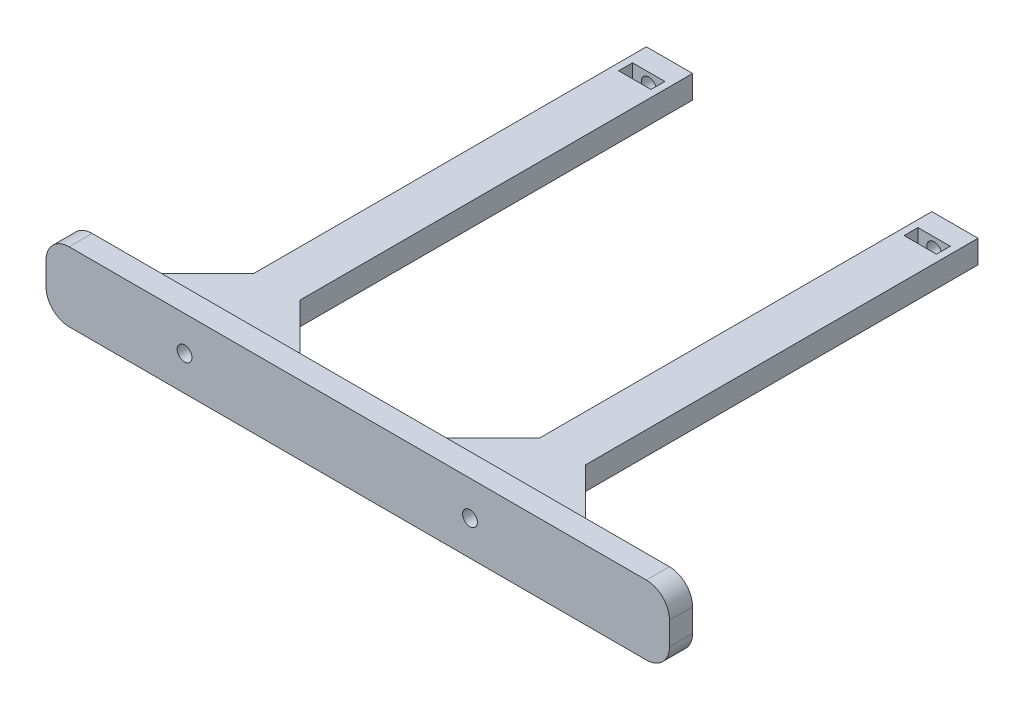
ISO-10303-21;
HEADER;
FILE_DESCRIPTION(('STEP AP214'),'2;1');
FILE_NAME('part.step','',(''),(''),'','','');
FILE_SCHEMA(('AUTOMOTIVE_DESIGN { 1 0 10303 214 1 1 1 1 }'));
ENDSEC;
DATA;
#1=APPLICATION_CONTEXT('core data for automotive mechanical design processes');
#2=APPLICATION_PROTOCOL_DEFINITION('international standard','automotive_design',2000,#1);
#3=PRODUCT_CONTEXT('',#1,'mechanical');
#4=PRODUCT('Part','Part','',(#3));
#5=PRODUCT_RELATED_PRODUCT_CATEGORY('part','',(#4));
#6=PRODUCT_DEFINITION_FORMATION('','',#4);
#7=PRODUCT_DEFINITION_CONTEXT('part definition',#1,'design');
#8=PRODUCT_DEFINITION('design','',#6,#7);
#9=PRODUCT_DEFINITION_SHAPE('','',#8);
#10=(LENGTH_UNIT() NAMED_UNIT(*) SI_UNIT(.MILLI.,.METRE.));
#11=(NAMED_UNIT(*) PLANE_ANGLE_UNIT() SI_UNIT($,.RADIAN.));
#12=(NAMED_UNIT(*) SI_UNIT($,.STERADIAN.) SOLID_ANGLE_UNIT());
#13=UNCERTAINTY_MEASURE_WITH_UNIT(LENGTH_MEASURE(1.E-05),#10,'distance_accuracy_value','');
#14=(GEOMETRIC_REPRESENTATION_CONTEXT(3) GLOBAL_UNCERTAINTY_ASSIGNED_CONTEXT((#13)) GLOBAL_UNIT_ASSIGNED_CONTEXT((#10,
#11,#12)) REPRESENTATION_CONTEXT('',''));
#15=CARTESIAN_POINT('',(0.,0.,0.));
#16=DIRECTION('',(0.,0.,1.));
#17=DIRECTION('',(1.,0.,0.));
#18=AXIS2_PLACEMENT_3D('',#15,#16,#17);
#19=CARTESIAN_POINT('',(-22.7658705386994,-0.757071557066315,-100.));
#20=DIRECTION('',(-1.,0.,0.));
#21=DIRECTION('',(0.,0.,1.));
#22=AXIS2_PLACEMENT_3D('',#19,#20,#21);
#23=PLANE('',#22);
#24=DIRECTION('',(0.,-1.,0.));
#25=VECTOR('',#24,1.);
#26=CARTESIAN_POINT('',(-22.7658705386994,4.24292844293368,-15.));
#27=LINE('',#26,#25);
#28=CARTESIAN_POINT('',(-22.7658705386994,4.24292844293368,-15.));
#29=VERTEX_POINT('',#28);
#30=CARTESIAN_POINT('',(-22.7658705386994,-0.757071557066316,-15.));
#31=VERTEX_POINT('',#30);
#32=EDGE_CURVE('E298',#29,#31,#27,.T.);
#33=ORIENTED_EDGE('',*,*,#32,.T.);
#34=DIRECTION('',(0.,0.,1.));
#35=VECTOR('',#34,1.);
#36=CARTESIAN_POINT('',(-22.7658705386994,-0.757071557066315,-100.));
#37=LINE('',#36,#35);
#38=CARTESIAN_POINT('',(-22.7658705386994,-0.757071557066315,-100.));
#39=VERTEX_POINT('',#38);
#40=EDGE_CURVE('E354',#39,#31,#37,.T.);
#41=ORIENTED_EDGE('',*,*,#40,.F.);
#42=DIRECTION('',(0.,-1.,0.));
#43=VECTOR('',#42,1.);
#44=CARTESIAN_POINT('',(-22.7658705386994,-0.757071557066315,-100.));
#45=LINE('',#44,#43);
#46=CARTESIAN_POINT('',(-22.7658705386994,4.24292844293368,-100.));
#47=VERTEX_POINT('',#46);
#48=EDGE_CURVE('E346',#47,#39,#45,.T.);
#49=ORIENTED_EDGE('',*,*,#48,.F.);
#50=DIRECTION('',(0.,0.,1.));
#51=VECTOR('',#50,1.);
#52=CARTESIAN_POINT('',(-22.7658705386994,4.24292844293368,-100.));
#53=LINE('',#52,#51);
#54=EDGE_CURVE('E357',#47,#29,#53,.T.);
#55=ORIENTED_EDGE('',*,*,#54,.T.);
#56=EDGE_LOOP('',(#33,#41,#49,#55));
#57=FACE_BOUND('',#56,.T.);
#58=ADVANCED_FACE('F36',(#57),#23,.F.);
#59=CARTESIAN_POINT('',(29.0341294613006,-0.757071557066316,-100.));
#60=DIRECTION('',(1.,0.,0.));
#61=DIRECTION('',(0.,0.,-1.));
#62=AXIS2_PLACEMENT_3D('',#59,#60,#61);
#63=PLANE('',#62);
#64=DIRECTION('',(0.,-1.,0.));
#65=VECTOR('',#64,1.);
#66=CARTESIAN_POINT('',(29.0341294613006,4.24292844293368,-15.));
#67=LINE('',#66,#65);
#68=CARTESIAN_POINT('',(29.0341294613006,4.24292844293368,-15.));
#69=VERTEX_POINT('',#68);
#70=CARTESIAN_POINT('',(29.0341294613006,-0.757071557066316,-15.));
#71=VERTEX_POINT('',#70);
#72=EDGE_CURVE('E313',#69,#71,#67,.T.);
#73=ORIENTED_EDGE('',*,*,#72,.F.);
#74=DIRECTION('',(0.,0.,1.));
#75=VECTOR('',#74,1.);
#76=CARTESIAN_POINT('',(29.0341294613006,4.24292844293368,-100.));
#77=LINE('',#76,#75);
#78=CARTESIAN_POINT('',(29.0341294613006,4.24292844293368,-100.));
#79=VERTEX_POINT('',#78);
#80=EDGE_CURVE('E384',#79,#69,#77,.T.);
#81=ORIENTED_EDGE('',*,*,#80,.F.);
#82=DIRECTION('',(0.,1.,0.));
#83=VECTOR('',#82,1.);
#84=CARTESIAN_POINT('',(29.0341294613006,-0.757071557066316,-100.));
#85=LINE('',#84,#83);
#86=CARTESIAN_POINT('',(29.0341294613006,-0.757071557066316,-100.));
#87=VERTEX_POINT('',#86);
#88=EDGE_CURVE('E364',#87,#79,#85,.T.);
#89=ORIENTED_EDGE('',*,*,#88,.F.);
#90=DIRECTION('',(0.,0.,1.));
#91=VECTOR('',#90,1.);
#92=CARTESIAN_POINT('',(29.0341294613006,-0.757071557066316,-100.));
#93=LINE('',#92,#91);
#94=EDGE_CURVE('E374',#87,#71,#93,.T.);
#95=ORIENTED_EDGE('',*,*,#94,.T.);
#96=EDGE_LOOP('',(#73,#81,#89,#95));
#97=FACE_BOUND('',#96,.T.);
#98=ADVANCED_FACE('F496',(#97),#63,.F.);
#99=CARTESIAN_POINT('',(-32.7658705386994,-0.757071557066315,-100.));
#100=DIRECTION('',(1.,0.,0.));
#101=DIRECTION('',(0.,0.,-1.));
#102=AXIS2_PLACEMENT_3D('',#99,#100,#101);
#103=PLANE('',#102);
#104=DIRECTION('',(0.,-1.,0.));
#105=VECTOR('',#104,1.);
#106=CARTESIAN_POINT('',(-32.7658705386994,4.24292844293368,-15.));
#107=LINE('',#106,#105);
#108=CARTESIAN_POINT('',(-32.7658705386994,4.24292844293368,-15.));
#109=VERTEX_POINT('',#108);
#110=CARTESIAN_POINT('',(-32.7658705386994,-0.757071557066315,-15.));
#111=VERTEX_POINT('',#110);
#112=EDGE_CURVE('E336',#109,#111,#107,.T.);
#113=ORIENTED_EDGE('',*,*,#112,.F.);
#114=DIRECTION('',(0.,0.,1.));
#115=VECTOR('',#114,1.);
#116=CARTESIAN_POINT('',(-32.7658705386994,4.24292844293368,-100.));
#117=LINE('',#116,#115);
#118=CARTESIAN_POINT('',(-32.7658705386994,4.24292844293368,-100.));
#119=VERTEX_POINT('',#118);
#120=EDGE_CURVE('E360',#119,#109,#117,.T.);
#121=ORIENTED_EDGE('',*,*,#120,.F.);
#122=DIRECTION('',(0.,1.,0.));
#123=VECTOR('',#122,1.);
#124=CARTESIAN_POINT('',(-32.7658705386994,-0.757071557066315,-100.));
#125=LINE('',#124,#123);
#126=CARTESIAN_POINT('',(-32.7658705386994,-0.757071557066315,-100.));
#127=VERTEX_POINT('',#126);
#128=EDGE_CURVE('E340',#127,#119,#125,.T.);
#129=ORIENTED_EDGE('',*,*,#128,.F.);
#130=DIRECTION('',(0.,0.,1.));
#131=VECTOR('',#130,1.);
#132=CARTESIAN_POINT('',(-32.7658705386994,-0.757071557066315,-100.));
#133=LINE('',#132,#131);
#134=EDGE_CURVE('E350',#127,#111,#133,.T.);
#135=ORIENTED_EDGE('',*,*,#134,.T.);
#136=EDGE_LOOP('',(#113,#121,#129,#135));
#137=FACE_BOUND('',#136,.T.);
#138=ADVANCED_FACE('F502',(#137),#103,.F.);
#139=CARTESIAN_POINT('',(0.,0.,0.));
#140=DIRECTION('',(0.,0.,1.));
#141=DIRECTION('',(1.,0.,0.));
#142=AXIS2_PLACEMENT_3D('',#139,#140,#141);
#143=PLANE('',#142);
#144=DIRECTION('',(1.,0.,0.));
#145=VECTOR('',#144,1.);
#146=CARTESIAN_POINT('',(39.0341294613006,4.24292844293368,0.));
#147=LINE('',#146,#145);
#148=CARTESIAN_POINT('',(14.0341294613007,4.24292844293368,0.));
#149=VERTEX_POINT('',#148);
#150=CARTESIAN_POINT('',(54.0341294613006,4.24292844293368,0.));
#151=VERTEX_POINT('',#150);
#152=EDGE_CURVE('E363',#149,#151,#147,.T.);
#153=ORIENTED_EDGE('',*,*,#152,.F.);
#154=DIRECTION('',(0.,-1.,0.));
#155=VECTOR('',#154,1.);
#156=CARTESIAN_POINT('',(14.0341294613006,4.24292844293368,0.));
#157=LINE('',#156,#155);
#158=CARTESIAN_POINT('',(14.0341294613006,-0.757071557066316,0.));
#159=VERTEX_POINT('',#158);
#160=EDGE_CURVE('E310',#149,#159,#157,.T.);
#161=ORIENTED_EDGE('',*,*,#160,.T.);
#162=DIRECTION('',(-1.,0.,0.));
#163=VECTOR('',#162,1.);
#164=CARTESIAN_POINT('',(39.0341294613006,-0.757071557066316,0.));
#165=LINE('',#164,#163);
#166=CARTESIAN_POINT('',(54.0341294613006,-0.757071557066315,0.));
#167=VERTEX_POINT('',#166);
#168=EDGE_CURVE('E368',#167,#159,#165,.T.);
#169=ORIENTED_EDGE('',*,*,#168,.F.);
#170=DIRECTION('',(0.,1.,0.));
#171=VECTOR('',#170,1.);
#172=CARTESIAN_POINT('',(54.0341294613006,-21.9702749926627,0.));
#173=LINE('',#172,#171);
#174=EDGE_CURVE('E319',#167,#151,#173,.T.);
#175=ORIENTED_EDGE('',*,*,#174,.T.);
#176=EDGE_LOOP('',(#153,#161,#169,#175));
#177=FACE_BOUND('',#176,.T.);
#178=DIRECTION('',(-1.,0.,0.));
#179=VECTOR('',#178,1.);
#180=CARTESIAN_POINT('',(-57.7658705386994,9.24292844293369,0.));
#181=LINE('',#180,#179);
#182=CARTESIAN_POINT('',(72.2341294613006,9.24292844293369,0.));
#183=VERTEX_POINT('',#182);
#184=CARTESIAN_POINT('',(-52.7658705386994,9.24292844293369,0.));
#185=VERTEX_POINT('',#184);
#186=EDGE_CURVE('E398',#183,#185,#181,.T.);
#187=ORIENTED_EDGE('',*,*,#186,.F.);
#188=CARTESIAN_POINT('',(72.2341294613006,4.24292844293369,0.));
#189=DIRECTION('',(0.,0.,1.));
#190=DIRECTION('',(1.,0.,0.));
#191=AXIS2_PLACEMENT_3D('',#188,#189,#190);
#192=CIRCLE('',#191,5.);
#193=CARTESIAN_POINT('',(77.2341294613007,4.24292844293369,0.));
#194=VERTEX_POINT('',#193);
#195=EDGE_CURVE('E440',#183,#194,#192,.F.);
#196=ORIENTED_EDGE('',*,*,#195,.T.);
#197=DIRECTION('',(0.,1.,0.));
#198=VECTOR('',#197,1.);
#199=CARTESIAN_POINT('',(77.2341294613007,9.24292844293369,0.));
#200=LINE('',#199,#198);
#201=CARTESIAN_POINT('',(77.2341294613007,-0.757071557066311,0.));
#202=VERTEX_POINT('',#201);
#203=EDGE_CURVE('E412',#202,#194,#200,.T.);
#204=ORIENTED_EDGE('',*,*,#203,.F.);
#205=CARTESIAN_POINT('',(72.2341294613006,-0.757071557066311,0.));
#206=DIRECTION('',(0.,0.,1.));
#207=DIRECTION('',(1.,0.,0.));
#208=AXIS2_PLACEMENT_3D('',#205,#206,#207);
#209=CIRCLE('',#208,5.);
#210=CARTESIAN_POINT('',(72.2341294613006,-5.75707155706631,0.));
#211=VERTEX_POINT('',#210);
#212=EDGE_CURVE('E438',#202,#211,#209,.F.);
#213=ORIENTED_EDGE('',*,*,#212,.T.);
#214=DIRECTION('',(1.,0.,0.));
#215=VECTOR('',#214,1.);
#216=CARTESIAN_POINT('',(-57.7658705386994,-5.75707155706631,0.));
#217=LINE('',#216,#215);
#218=CARTESIAN_POINT('',(-52.7658705386994,-5.75707155706631,0.));
#219=VERTEX_POINT('',#218);
#220=EDGE_CURVE('E409',#219,#211,#217,.T.);
#221=ORIENTED_EDGE('',*,*,#220,.F.);
#222=CARTESIAN_POINT('',(-52.7658705386994,-0.757071557066312,0.));
#223=DIRECTION('',(0.,0.,1.));
#224=DIRECTION('',(1.,0.,0.));
#225=AXIS2_PLACEMENT_3D('',#222,#223,#224);
#226=CIRCLE('',#225,5.);
#227=CARTESIAN_POINT('',(-57.7658705386994,-0.757071557066311,0.));
#228=VERTEX_POINT('',#227);
#229=EDGE_CURVE('E421',#219,#228,#226,.F.);
#230=ORIENTED_EDGE('',*,*,#229,.T.);
#231=DIRECTION('',(0.,-1.,0.));
#232=VECTOR('',#231,1.);
#233=CARTESIAN_POINT('',(-57.7658705386994,9.24292844293369,0.));
#234=LINE('',#233,#232);
#235=CARTESIAN_POINT('',(-57.7658705386994,4.24292844293369,0.));
#236=VERTEX_POINT('',#235);
#237=EDGE_CURVE('E393',#236,#228,#234,.T.);
#238=ORIENTED_EDGE('',*,*,#237,.F.);
#239=CARTESIAN_POINT('',(-52.7658705386994,4.24292844293369,0.));
#240=DIRECTION('',(0.,0.,1.));
#241=DIRECTION('',(1.,0.,0.));
#242=AXIS2_PLACEMENT_3D('',#239,#240,#241);
#243=CIRCLE('',#242,5.);
#244=EDGE_CURVE('E418',#236,#185,#243,.F.);
#245=ORIENTED_EDGE('',*,*,#244,.T.);
#246=EDGE_LOOP('',(#187,#196,#204,#213,#221,#230,#238,#245));
#247=FACE_BOUND('',#246,.T.);
#248=DIRECTION('',(0.,-1.,0.));
#249=VECTOR('',#248,1.);
#250=CARTESIAN_POINT('',(-7.76587053869936,4.24292844293368,0.));
#251=LINE('',#250,#249);
#252=CARTESIAN_POINT('',(-7.76587053869936,4.24292844293368,0.));
#253=VERTEX_POINT('',#252);
#254=CARTESIAN_POINT('',(-7.76587053869936,-0.757071557066316,0.));
#255=VERTEX_POINT('',#254);
#256=EDGE_CURVE('E301',#253,#255,#251,.T.);
#257=ORIENTED_EDGE('',*,*,#256,.F.);
#258=DIRECTION('',(1.,0.,0.));
#259=VECTOR('',#258,1.);
#260=CARTESIAN_POINT('',(-22.7658705386994,4.24292844293368,0.));
#261=LINE('',#260,#259);
#262=CARTESIAN_POINT('',(-47.7658705386994,4.24292844293368,0.));
#263=VERTEX_POINT('',#262);
#264=EDGE_CURVE('E339',#263,#253,#261,.T.);
#265=ORIENTED_EDGE('',*,*,#264,.F.);
#266=DIRECTION('',(0.,-1.,0.));
#267=VECTOR('',#266,1.);
#268=CARTESIAN_POINT('',(-47.7658705386994,4.24292844293368,0.));
#269=LINE('',#268,#267);
#270=CARTESIAN_POINT('',(-47.7658705386994,-0.757071557066315,0.));
#271=VERTEX_POINT('',#270);
#272=EDGE_CURVE('E333',#263,#271,#269,.T.);
#273=ORIENTED_EDGE('',*,*,#272,.T.);
#274=DIRECTION('',(-1.,0.,0.));
#275=VECTOR('',#274,1.);
#276=CARTESIAN_POINT('',(-22.7658705386994,-0.757071557066315,0.));
#277=LINE('',#276,#275);
#278=EDGE_CURVE('E344',#255,#271,#277,.T.);
#279=ORIENTED_EDGE('',*,*,#278,.F.);
#280=EDGE_LOOP('',(#257,#265,#273,#279));
#281=FACE_BOUND('',#280,.T.);
#282=ADVANCED_FACE('F513',(#177,#247,#281),#143,.F.);
#283=CARTESIAN_POINT('',(-57.7658705386994,9.24292844293369,5.));
#284=DIRECTION('',(1.,0.,0.));
#285=DIRECTION('',(0.,0.,-1.));
#286=AXIS2_PLACEMENT_3D('',#283,#284,#285);
#287=PLANE('',#286);
#288=ORIENTED_EDGE('',*,*,#237,.T.);
#289=DIRECTION('',(0.,0.,-1.));
#290=VECTOR('',#289,1.);
#291=CARTESIAN_POINT('',(-57.7658705386994,-0.757071557066311,5.));
#292=LINE('',#291,#290);
#293=CARTESIAN_POINT('',(-57.7658705386994,-0.757071557066311,5.));
#294=VERTEX_POINT('',#293);
#295=EDGE_CURVE('E426',#228,#294,#292,.F.);
#296=ORIENTED_EDGE('',*,*,#295,.T.);
#297=DIRECTION('',(0.,-1.,0.));
#298=VECTOR('',#297,1.);
#299=CARTESIAN_POINT('',(-57.7658705386994,9.24292844293369,5.));
#300=LINE('',#299,#298);
#301=CARTESIAN_POINT('',(-57.7658705386994,4.24292844293369,5.));
#302=VERTEX_POINT('',#301);
#303=EDGE_CURVE('E394',#302,#294,#300,.T.);
#304=ORIENTED_EDGE('',*,*,#303,.F.);
#305=DIRECTION('',(0.,0.,-1.));
#306=VECTOR('',#305,1.);
#307=CARTESIAN_POINT('',(-57.7658705386994,4.24292844293369,5.));
#308=LINE('',#307,#306);
#309=EDGE_CURVE('E423',#302,#236,#308,.T.);
#310=ORIENTED_EDGE('',*,*,#309,.T.);
#311=EDGE_LOOP('',(#288,#296,#304,#310));
#312=FACE_BOUND('',#311,.T.);
#313=ADVANCED_FACE('F546',(#312),#287,.F.);
#314=CARTESIAN_POINT('',(-57.7658705386994,-5.75707155706631,5.));
#315=DIRECTION('',(0.,1.,0.));
#316=DIRECTION('',(0.,0.,1.));
#317=AXIS2_PLACEMENT_3D('',#314,#315,#316);
#318=PLANE('',#317);
#319=ORIENTED_EDGE('',*,*,#220,.T.);
#320=DIRECTION('',(0.,0.,-1.));
#321=VECTOR('',#320,1.);
#322=CARTESIAN_POINT('',(72.2341294613006,-5.75707155706631,5.));
#323=LINE('',#322,#321);
#324=CARTESIAN_POINT('',(72.2341294613006,-5.75707155706631,5.));
#325=VERTEX_POINT('',#324);
#326=EDGE_CURVE('E451',#211,#325,#323,.F.);
#327=ORIENTED_EDGE('',*,*,#326,.T.);
#328=DIRECTION('',(1.,0.,0.));
#329=VECTOR('',#328,1.);
#330=CARTESIAN_POINT('',(-57.7658705386994,-5.75707155706631,5.));
#331=LINE('',#330,#329);
#332=CARTESIAN_POINT('',(-52.7658705386994,-5.75707155706631,5.));
#333=VERTEX_POINT('',#332);
#334=EDGE_CURVE('E397',#333,#325,#331,.T.);
#335=ORIENTED_EDGE('',*,*,#334,.F.);
#336=DIRECTION('',(0.,0.,-1.));
#337=VECTOR('',#336,1.);
#338=CARTESIAN_POINT('',(-52.7658705386994,-5.75707155706631,5.));
#339=LINE('',#338,#337);
#340=EDGE_CURVE('E406',#333,#219,#339,.T.);
#341=ORIENTED_EDGE('',*,*,#340,.T.);
#342=EDGE_LOOP('',(#319,#327,#335,#341));
#343=FACE_BOUND('',#342,.T.);
#344=ADVANCED_FACE('F554',(#343),#318,.F.);
#345=CARTESIAN_POINT('',(77.2341294613007,9.24292844293369,5.));
#346=DIRECTION('',(-1.,0.,0.));
#347=DIRECTION('',(0.,0.,1.));
#348=AXIS2_PLACEMENT_3D('',#345,#346,#347);
#349=PLANE('',#348);
#350=ORIENTED_EDGE('',*,*,#203,.T.);
#351=DIRECTION('',(0.,0.,-1.));
#352=VECTOR('',#351,1.);
#353=CARTESIAN_POINT('',(77.2341294613007,4.24292844293369,5.));
#354=LINE('',#353,#352);
#355=CARTESIAN_POINT('',(77.2341294613007,4.24292844293369,5.));
#356=VERTEX_POINT('',#355);
#357=EDGE_CURVE('E445',#194,#356,#354,.F.);
#358=ORIENTED_EDGE('',*,*,#357,.T.);
#359=DIRECTION('',(0.,1.,0.));
#360=VECTOR('',#359,1.);
#361=CARTESIAN_POINT('',(77.2341294613007,9.24292844293369,5.));
#362=LINE('',#361,#360);
#363=CARTESIAN_POINT('',(77.2341294613007,-0.757071557066311,5.));
#364=VERTEX_POINT('',#363);
#365=EDGE_CURVE('E401',#364,#356,#362,.T.);
#366=ORIENTED_EDGE('',*,*,#365,.F.);
#367=DIRECTION('',(0.,0.,-1.));
#368=VECTOR('',#367,1.);
#369=CARTESIAN_POINT('',(77.2341294613007,-0.757071557066311,5.));
#370=LINE('',#369,#368);
#371=EDGE_CURVE('E442',#364,#202,#370,.T.);
#372=ORIENTED_EDGE('',*,*,#371,.T.);
#373=EDGE_LOOP('',(#350,#358,#366,#372));
#374=FACE_BOUND('',#373,.T.);
#375=ADVANCED_FACE('F550',(#374),#349,.F.);
#376=CARTESIAN_POINT('',(-57.7658705386994,9.24292844293369,5.));
#377=DIRECTION('',(0.,-1.,0.));
#378=DIRECTION('',(0.,0.,-1.));
#379=AXIS2_PLACEMENT_3D('',#376,#377,#378);
#380=PLANE('',#379);
#381=DIRECTION('',(-1.,0.,0.));
#382=VECTOR('',#381,1.);
#383=CARTESIAN_POINT('',(-57.7658705386994,9.24292844293369,5.));
#384=LINE('',#383,#382);
#385=CARTESIAN_POINT('',(72.2341294613006,9.24292844293369,5.));
#386=VERTEX_POINT('',#385);
#387=CARTESIAN_POINT('',(-52.7658705386994,9.24292844293369,5.));
#388=VERTEX_POINT('',#387);
#389=EDGE_CURVE('E404',#386,#388,#384,.T.);
#390=ORIENTED_EDGE('',*,*,#389,.F.);
#391=DIRECTION('',(0.,0.,-1.));
#392=VECTOR('',#391,1.);
#393=CARTESIAN_POINT('',(72.2341294613006,9.24292844293369,5.));
#394=LINE('',#393,#392);
#395=EDGE_CURVE('E435',#386,#183,#394,.T.);
#396=ORIENTED_EDGE('',*,*,#395,.T.);
#397=ORIENTED_EDGE('',*,*,#186,.T.);
#398=DIRECTION('',(0.,0.,-1.));
#399=VECTOR('',#398,1.);
#400=CARTESIAN_POINT('',(-52.7658705386994,9.24292844293369,5.));
#401=LINE('',#400,#399);
#402=EDGE_CURVE('E432',#185,#388,#401,.F.);
#403=ORIENTED_EDGE('',*,*,#402,.T.);
#404=EDGE_LOOP('',(#390,#396,#397,#403));
#405=FACE_BOUND('',#404,.T.);
#406=ADVANCED_FACE('F542',(#405),#380,.F.);
#407=CARTESIAN_POINT('',(0.,0.,5.));
#408=DIRECTION('',(0.,0.,1.));
#409=DIRECTION('',(1.,0.,0.));
#410=AXIS2_PLACEMENT_3D('',#407,#408,#409);
#411=PLANE('',#410);
#412=CARTESIAN_POINT('',(34.0341294613006,1.74292844293368,5.));
#413=DIRECTION('',(0.,0.,-1.));
#414=DIRECTION('',(-1.,0.,0.));
#415=AXIS2_PLACEMENT_3D('',#412,#413,#414);
#416=CIRCLE('',#415,1.6);
#417=CARTESIAN_POINT('',(32.4341294613006,1.74292844293368,5.));
#418=VERTEX_POINT('',#417);
#419=EDGE_CURVE('E387',#418,#418,#416,.T.);
#420=ORIENTED_EDGE('',*,*,#419,.T.);
#421=EDGE_LOOP('',(#420));
#422=FACE_BOUND('',#421,.T.);
#423=CARTESIAN_POINT('',(-27.7658705386994,1.74292844293368,5.));
#424=DIRECTION('',(0.,0.,-1.));
#425=DIRECTION('',(-1.,0.,0.));
#426=AXIS2_PLACEMENT_3D('',#423,#424,#425);
#427=CIRCLE('',#426,1.6);
#428=CARTESIAN_POINT('',(-29.3658705386994,1.74292844293368,5.));
#429=VERTEX_POINT('',#428);
#430=EDGE_CURVE('E390',#429,#429,#427,.T.);
#431=ORIENTED_EDGE('',*,*,#430,.T.);
#432=EDGE_LOOP('',(#431));
#433=FACE_BOUND('',#432,.T.);
#434=ORIENTED_EDGE('',*,*,#365,.T.);
#435=CARTESIAN_POINT('',(72.2341294613006,4.24292844293369,5.));
#436=DIRECTION('',(0.,0.,1.));
#437=DIRECTION('',(1.,0.,0.));
#438=AXIS2_PLACEMENT_3D('',#435,#436,#437);
#439=CIRCLE('',#438,5.);
#440=EDGE_CURVE('E449',#356,#386,#439,.T.);
#441=ORIENTED_EDGE('',*,*,#440,.T.);
#442=ORIENTED_EDGE('',*,*,#389,.T.);
#443=CARTESIAN_POINT('',(-52.7658705386994,4.24292844293369,5.));
#444=DIRECTION('',(0.,0.,1.));
#445=DIRECTION('',(1.,0.,0.));
#446=AXIS2_PLACEMENT_3D('',#443,#444,#445);
#447=CIRCLE('',#446,5.);
#448=EDGE_CURVE('E428',#388,#302,#447,.T.);
#449=ORIENTED_EDGE('',*,*,#448,.T.);
#450=ORIENTED_EDGE('',*,*,#303,.T.);
#451=CARTESIAN_POINT('',(-52.7658705386994,-0.757071557066312,5.));
#452=DIRECTION('',(0.,0.,1.));
#453=DIRECTION('',(1.,0.,0.));
#454=AXIS2_PLACEMENT_3D('',#451,#452,#453);
#455=CIRCLE('',#454,5.);
#456=EDGE_CURVE('E430',#294,#333,#455,.T.);
#457=ORIENTED_EDGE('',*,*,#456,.T.);
#458=ORIENTED_EDGE('',*,*,#334,.T.);
#459=CARTESIAN_POINT('',(72.2341294613006,-0.757071557066311,5.));
#460=DIRECTION('',(0.,0.,1.));
#461=DIRECTION('',(1.,0.,0.));
#462=AXIS2_PLACEMENT_3D('',#459,#460,#461);
#463=CIRCLE('',#462,5.);
#464=EDGE_CURVE('E447',#325,#364,#463,.T.);
#465=ORIENTED_EDGE('',*,*,#464,.T.);
#466=EDGE_LOOP('',(#434,#441,#442,#449,#450,#457,#458,#465));
#467=FACE_BOUND('',#466,.T.);
#468=ADVANCED_FACE('F538',(#422,#433,#467),#411,.T.);
#469=CARTESIAN_POINT('',(-52.7658705386994,-0.757071557066312,5.));
#470=DIRECTION('',(0.,0.,-1.));
#471=DIRECTION('',(-1.,0.,0.));
#472=AXIS2_PLACEMENT_3D('',#469,#470,#471);
#473=CYLINDRICAL_SURFACE('',#472,5.);
#474=ORIENTED_EDGE('',*,*,#456,.F.);
#475=ORIENTED_EDGE('',*,*,#295,.F.);
#476=ORIENTED_EDGE('',*,*,#229,.F.);
#477=ORIENTED_EDGE('',*,*,#340,.F.);
#478=EDGE_LOOP('',(#474,#475,#476,#477));
#479=FACE_BOUND('',#478,.T.);
#480=ADVANCED_FACE('F541',(#479),#473,.T.);
#481=CARTESIAN_POINT('',(-52.7658705386994,4.24292844293369,5.));
#482=DIRECTION('',(0.,0.,-1.));
#483=DIRECTION('',(-1.,0.,0.));
#484=AXIS2_PLACEMENT_3D('',#481,#482,#483);
#485=CYLINDRICAL_SURFACE('',#484,5.);
#486=ORIENTED_EDGE('',*,*,#448,.F.);
#487=ORIENTED_EDGE('',*,*,#402,.F.);
#488=ORIENTED_EDGE('',*,*,#244,.F.);
#489=ORIENTED_EDGE('',*,*,#309,.F.);
#490=EDGE_LOOP('',(#486,#487,#488,#489));
#491=FACE_BOUND('',#490,.T.);
#492=ADVANCED_FACE('F564',(#491),#485,.T.);
#493=CARTESIAN_POINT('',(72.2341294613006,4.24292844293369,5.));
#494=DIRECTION('',(0.,0.,-1.));
#495=DIRECTION('',(-1.,0.,0.));
#496=AXIS2_PLACEMENT_3D('',#493,#494,#495);
#497=CYLINDRICAL_SURFACE('',#496,5.);
#498=ORIENTED_EDGE('',*,*,#440,.F.);
#499=ORIENTED_EDGE('',*,*,#357,.F.);
#500=ORIENTED_EDGE('',*,*,#195,.F.);
#501=ORIENTED_EDGE('',*,*,#395,.F.);
#502=EDGE_LOOP('',(#498,#499,#500,#501));
#503=FACE_BOUND('',#502,.T.);
#504=ADVANCED_FACE('F567',(#503),#497,.T.);
#505=CARTESIAN_POINT('',(72.2341294613006,-0.757071557066311,5.));
#506=DIRECTION('',(0.,0.,-1.));
#507=DIRECTION('',(-1.,0.,0.));
#508=AXIS2_PLACEMENT_3D('',#505,#506,#507);
#509=CYLINDRICAL_SURFACE('',#508,5.);
#510=ORIENTED_EDGE('',*,*,#464,.F.);
#511=ORIENTED_EDGE('',*,*,#326,.F.);
#512=ORIENTED_EDGE('',*,*,#212,.F.);
#513=ORIENTED_EDGE('',*,*,#371,.F.);
#514=EDGE_LOOP('',(#510,#511,#512,#513));
#515=FACE_BOUND('',#514,.T.);
#516=ADVANCED_FACE('F38',(#515),#509,.T.);
#517=CARTESIAN_POINT('',(-27.7658705386994,1.74292844293368,5.));
#518=DIRECTION('',(0.,0.,-1.));
#519=DIRECTION('',(-1.,0.,0.));
#520=AXIS2_PLACEMENT_3D('',#517,#518,#519);
#521=CYLINDRICAL_SURFACE('',#520,1.6);
#522=ORIENTED_EDGE('',*,*,#430,.F.);
#523=EDGE_LOOP('',(#522));
#524=FACE_BOUND('',#523,.T.);
#525=CARTESIAN_POINT('',(-27.7658705386994,1.74292844293368,-92.5));
#526=DIRECTION('',(0.,0.,-1.));
#527=DIRECTION('',(-1.,0.,0.));
#528=AXIS2_PLACEMENT_3D('',#525,#526,#527);
#529=CIRCLE('',#528,1.6);
#530=CARTESIAN_POINT('',(-29.3658705386994,1.74292844293368,-92.5));
#531=VERTEX_POINT('',#530);
#532=EDGE_CURVE('E242',#531,#531,#529,.T.);
#533=ORIENTED_EDGE('',*,*,#532,.T.);
#534=EDGE_LOOP('',(#533));
#535=FACE_BOUND('',#534,.T.);
#536=ADVANCED_FACE('F531',(#524,#535),#521,.F.);
#537=CARTESIAN_POINT('',(34.0341294613006,1.74292844293368,5.));
#538=DIRECTION('',(0.,0.,-1.));
#539=DIRECTION('',(-1.,0.,0.));
#540=AXIS2_PLACEMENT_3D('',#537,#538,#539);
#541=CYLINDRICAL_SURFACE('',#540,1.6);
#542=ORIENTED_EDGE('',*,*,#419,.F.);
#543=EDGE_LOOP('',(#542));
#544=FACE_BOUND('',#543,.T.);
#545=CARTESIAN_POINT('',(34.0341294613006,1.74292844293368,-92.5));
#546=DIRECTION('',(0.,0.,1.));
#547=DIRECTION('',(1.,0.,0.));
#548=AXIS2_PLACEMENT_3D('',#545,#546,#547);
#549=CIRCLE('',#548,1.6);
#550=CARTESIAN_POINT('',(35.6341294613006,1.74292844293368,-92.5));
#551=VERTEX_POINT('',#550);
#552=EDGE_CURVE('E40',#551,#551,#549,.T.);
#553=ORIENTED_EDGE('',*,*,#552,.F.);
#554=EDGE_LOOP('',(#553));
#555=FACE_BOUND('',#554,.T.);
#556=ADVANCED_FACE('F526',(#544,#555),#541,.F.);
#557=CARTESIAN_POINT('',(39.0341294613006,4.24292844293368,-100.));
#558=DIRECTION('',(0.,-1.,0.));
#559=DIRECTION('',(0.,0.,-1.));
#560=AXIS2_PLACEMENT_3D('',#557,#558,#559);
#561=PLANE('',#560);
#562=DIRECTION('',(-1.,0.,0.));
#563=VECTOR('',#562,1.);
#564=CARTESIAN_POINT('',(39.0341294613006,4.24292844293368,-95.5));
#565=LINE('',#564,#563);
#566=CARTESIAN_POINT('',(37.5341294613006,4.24292844293368,-95.5));
#567=VERTEX_POINT('',#566);
#568=CARTESIAN_POINT('',(30.5341294613006,4.24292844293368,-95.5));
#569=VERTEX_POINT('',#568);
#570=EDGE_CURVE('E267',#567,#569,#565,.T.);
#571=ORIENTED_EDGE('',*,*,#570,.F.);
#572=DIRECTION('',(0.,0.,1.));
#573=VECTOR('',#572,1.);
#574=CARTESIAN_POINT('',(37.5341294613006,4.24292844293368,-100.));
#575=LINE('',#574,#573);
#576=CARTESIAN_POINT('',(37.5341294613006,4.24292844293368,-92.5));
#577=VERTEX_POINT('',#576);
#578=EDGE_CURVE('E269',#567,#577,#575,.T.);
#579=ORIENTED_EDGE('',*,*,#578,.T.);
#580=DIRECTION('',(-1.,0.,0.));
#581=VECTOR('',#580,1.);
#582=CARTESIAN_POINT('',(39.0341294613006,4.24292844293368,-92.5));
#583=LINE('',#582,#581);
#584=CARTESIAN_POINT('',(30.5341294613006,4.24292844293368,-92.5));
#585=VERTEX_POINT('',#584);
#586=EDGE_CURVE('E260',#577,#585,#583,.T.);
#587=ORIENTED_EDGE('',*,*,#586,.T.);
#588=DIRECTION('',(0.,0.,1.));
#589=VECTOR('',#588,1.);
#590=CARTESIAN_POINT('',(30.5341294613006,4.24292844293368,-100.));
#591=LINE('',#590,#589);
#592=EDGE_CURVE('E232',#569,#585,#591,.T.);
#593=ORIENTED_EDGE('',*,*,#592,.F.);
#594=EDGE_LOOP('',(#571,#579,#587,#593));
#595=FACE_BOUND('',#594,.T.);
#596=ORIENTED_EDGE('',*,*,#152,.T.);
#597=DIRECTION('',(-0.707106781186547,0.,-0.707106781186548));
#598=VECTOR('',#597,1.);
#599=CARTESIAN_POINT('',(54.0341294613006,4.24292844293368,0.));
#600=LINE('',#599,#598);
#601=CARTESIAN_POINT('',(39.0341294613007,4.24292844293368,-15.));
#602=VERTEX_POINT('',#601);
#603=EDGE_CURVE('E316',#151,#602,#600,.T.);
#604=ORIENTED_EDGE('',*,*,#603,.T.);
#605=DIRECTION('',(0.,0.,1.));
#606=VECTOR('',#605,1.);
#607=CARTESIAN_POINT('',(39.0341294613006,4.24292844293368,-100.));
#608=LINE('',#607,#606);
#609=CARTESIAN_POINT('',(39.0341294613006,4.24292844293368,-100.));
#610=VERTEX_POINT('',#609);
#611=EDGE_CURVE('E381',#610,#602,#608,.T.);
#612=ORIENTED_EDGE('',*,*,#611,.F.);
#613=DIRECTION('',(1.,0.,0.));
#614=VECTOR('',#613,1.);
#615=CARTESIAN_POINT('',(39.0341294613006,4.24292844293368,-100.));
#616=LINE('',#615,#614);
#617=EDGE_CURVE('E367',#79,#610,#616,.T.);
#618=ORIENTED_EDGE('',*,*,#617,.F.);
#619=ORIENTED_EDGE('',*,*,#80,.T.);
#620=DIRECTION('',(-0.707106781186547,0.,0.707106781186548));
#621=VECTOR('',#620,1.);
#622=CARTESIAN_POINT('',(7.01706473065033,4.24292844293368,7.01706473065033));
#623=LINE('',#622,#621);
#624=EDGE_CURVE('E307',#69,#149,#623,.T.);
#625=ORIENTED_EDGE('',*,*,#624,.T.);
#626=EDGE_LOOP('',(#596,#604,#612,#618,#619,#625));
#627=FACE_BOUND('',#626,.T.);
#628=ADVANCED_FACE('F523',(#595,#627),#561,.F.);
#629=CARTESIAN_POINT('',(39.0341294613006,-0.757071557066316,-100.));
#630=DIRECTION('',(-1.,0.,0.));
#631=DIRECTION('',(0.,0.,1.));
#632=AXIS2_PLACEMENT_3D('',#629,#630,#631);
#633=PLANE('',#632);
#634=ORIENTED_EDGE('',*,*,#611,.T.);
#635=DIRECTION('',(0.,1.,0.));
#636=VECTOR('',#635,1.);
#637=CARTESIAN_POINT('',(39.0341294613007,-21.9702749926627,-15.));
#638=LINE('',#637,#636);
#639=CARTESIAN_POINT('',(39.0341294613007,-0.757071557066315,-15.));
#640=VERTEX_POINT('',#639);
#641=EDGE_CURVE('E320',#640,#602,#638,.T.);
#642=ORIENTED_EDGE('',*,*,#641,.F.);
#643=DIRECTION('',(0.,0.,1.));
#644=VECTOR('',#643,1.);
#645=CARTESIAN_POINT('',(39.0341294613006,-0.757071557066316,-100.));
#646=LINE('',#645,#644);
#647=CARTESIAN_POINT('',(39.0341294613006,-0.757071557066316,-100.));
#648=VERTEX_POINT('',#647);
#649=EDGE_CURVE('E378',#648,#640,#646,.T.);
#650=ORIENTED_EDGE('',*,*,#649,.F.);
#651=DIRECTION('',(0.,-1.,0.));
#652=VECTOR('',#651,1.);
#653=CARTESIAN_POINT('',(39.0341294613006,-0.757071557066316,-100.));
#654=LINE('',#653,#652);
#655=EDGE_CURVE('E370',#610,#648,#654,.T.);
#656=ORIENTED_EDGE('',*,*,#655,.F.);
#657=EDGE_LOOP('',(#634,#642,#650,#656));
#658=FACE_BOUND('',#657,.T.);
#659=ADVANCED_FACE('F520',(#658),#633,.F.);
#660=CARTESIAN_POINT('',(39.0341294613006,-0.757071557066316,-100.));
#661=DIRECTION('',(0.,1.,0.));
#662=DIRECTION('',(0.,0.,1.));
#663=AXIS2_PLACEMENT_3D('',#660,#661,#662);
#664=PLANE('',#663);
#665=DIRECTION('',(1.,0.,0.));
#666=VECTOR('',#665,1.);
#667=CARTESIAN_POINT('',(39.0341294613006,-0.757071557066316,-92.5));
#668=LINE('',#667,#666);
#669=CARTESIAN_POINT('',(30.5341294613006,-0.757071557066322,-92.5));
#670=VERTEX_POINT('',#669);
#671=CARTESIAN_POINT('',(37.5341294613006,-0.757071557066316,-92.5));
#672=VERTEX_POINT('',#671);
#673=EDGE_CURVE('E220',#670,#672,#668,.T.);
#674=ORIENTED_EDGE('',*,*,#673,.T.);
#675=DIRECTION('',(0.,0.,-1.));
#676=VECTOR('',#675,1.);
#677=CARTESIAN_POINT('',(37.5341294613006,-0.757071557066316,-100.));
#678=LINE('',#677,#676);
#679=CARTESIAN_POINT('',(37.5341294613006,-0.757071557066322,-95.5));
#680=VERTEX_POINT('',#679);
#681=EDGE_CURVE('E11',#672,#680,#678,.T.);
#682=ORIENTED_EDGE('',*,*,#681,.T.);
#683=DIRECTION('',(1.,0.,0.));
#684=VECTOR('',#683,1.);
#685=CARTESIAN_POINT('',(39.0341294613006,-0.757071557066316,-95.5));
#686=LINE('',#685,#684);
#687=CARTESIAN_POINT('',(30.5341294613006,-0.757071557066322,-95.5));
#688=VERTEX_POINT('',#687);
#689=EDGE_CURVE('E45',#688,#680,#686,.T.);
#690=ORIENTED_EDGE('',*,*,#689,.F.);
#691=DIRECTION('',(0.,0.,-1.));
#692=VECTOR('',#691,1.);
#693=CARTESIAN_POINT('',(30.5341294613006,-0.757071557066316,-100.));
#694=LINE('',#693,#692);
#695=EDGE_CURVE('E224',#670,#688,#694,.T.);
#696=ORIENTED_EDGE('',*,*,#695,.F.);
#697=EDGE_LOOP('',(#674,#682,#690,#696));
#698=FACE_BOUND('',#697,.T.);
#699=ORIENTED_EDGE('',*,*,#168,.T.);
#700=DIRECTION('',(-0.707106781186547,0.,0.707106781186548));
#701=VECTOR('',#700,1.);
#702=CARTESIAN_POINT('',(7.01706473065033,-0.757071557066316,7.01706473065033));
#703=LINE('',#702,#701);
#704=EDGE_CURVE('E304',#71,#159,#703,.T.);
#705=ORIENTED_EDGE('',*,*,#704,.F.);
#706=ORIENTED_EDGE('',*,*,#94,.F.);
#707=DIRECTION('',(-1.,0.,0.));
#708=VECTOR('',#707,1.);
#709=CARTESIAN_POINT('',(39.0341294613006,-0.757071557066316,-100.));
#710=LINE('',#709,#708);
#711=EDGE_CURVE('E372',#648,#87,#710,.T.);
#712=ORIENTED_EDGE('',*,*,#711,.F.);
#713=ORIENTED_EDGE('',*,*,#649,.T.);
#714=DIRECTION('',(0.707106781186547,0.,0.707106781186548));
#715=VECTOR('',#714,1.);
#716=CARTESIAN_POINT('',(54.0341294613006,-0.757071557066315,0.));
#717=LINE('',#716,#715);
#718=EDGE_CURVE('E322',#640,#167,#717,.T.);
#719=ORIENTED_EDGE('',*,*,#718,.T.);
#720=EDGE_LOOP('',(#699,#705,#706,#712,#713,#719));
#721=FACE_BOUND('',#720,.T.);
#722=ADVANCED_FACE('F237',(#698,#721),#664,.F.);
#723=CARTESIAN_POINT('',(0.,0.,-100.));
#724=DIRECTION('',(0.,0.,1.));
#725=DIRECTION('',(1.,0.,0.));
#726=AXIS2_PLACEMENT_3D('',#723,#724,#725);
#727=PLANE('',#726);
#728=CARTESIAN_POINT('',(34.0341294613006,1.74292844293368,-100.));
#729=DIRECTION('',(0.,0.,-1.));
#730=DIRECTION('',(-1.,0.,0.));
#731=AXIS2_PLACEMENT_3D('',#728,#729,#730);
#732=CIRCLE('',#731,1.6);
#733=CARTESIAN_POINT('',(32.4341294613006,1.74292844293368,-100.));
#734=VERTEX_POINT('',#733);
#735=EDGE_CURVE('E697',#734,#734,#732,.T.);
#736=ORIENTED_EDGE('',*,*,#735,.F.);
#737=EDGE_LOOP('',(#736));
#738=FACE_BOUND('',#737,.T.);
#739=ORIENTED_EDGE('',*,*,#88,.T.);
#740=ORIENTED_EDGE('',*,*,#617,.T.);
#741=ORIENTED_EDGE('',*,*,#655,.T.);
#742=ORIENTED_EDGE('',*,*,#711,.T.);
#743=EDGE_LOOP('',(#739,#740,#741,#742));
#744=FACE_BOUND('',#743,.T.);
#745=ADVANCED_FACE('F510',(#738,#744),#727,.F.);
#746=CARTESIAN_POINT('',(-22.7658705386994,4.24292844293368,-100.));
#747=DIRECTION('',(0.,-1.,0.));
#748=DIRECTION('',(0.,0.,-1.));
#749=AXIS2_PLACEMENT_3D('',#746,#747,#748);
#750=PLANE('',#749);
#751=DIRECTION('',(0.,0.,1.));
#752=VECTOR('',#751,1.);
#753=CARTESIAN_POINT('',(-31.2658705386993,4.24292844293368,-100.));
#754=LINE('',#753,#752);
#755=CARTESIAN_POINT('',(-31.2658705386993,4.24292844293368,-95.5));
#756=VERTEX_POINT('',#755);
#757=CARTESIAN_POINT('',(-31.2658705386993,4.24292844293368,-92.5));
#758=VERTEX_POINT('',#757);
#759=EDGE_CURVE('E289',#756,#758,#754,.T.);
#760=ORIENTED_EDGE('',*,*,#759,.F.);
#761=DIRECTION('',(1.,0.,0.));
#762=VECTOR('',#761,1.);
#763=CARTESIAN_POINT('',(-22.7658705386994,4.24292844293368,-95.5));
#764=LINE('',#763,#762);
#765=CARTESIAN_POINT('',(-24.2658705386993,4.24292844293368,-95.5));
#766=VERTEX_POINT('',#765);
#767=EDGE_CURVE('E291',#756,#766,#764,.T.);
#768=ORIENTED_EDGE('',*,*,#767,.T.);
#769=DIRECTION('',(0.,0.,1.));
#770=VECTOR('',#769,1.);
#771=CARTESIAN_POINT('',(-24.2658705386993,4.24292844293368,-100.));
#772=LINE('',#771,#770);
#773=CARTESIAN_POINT('',(-24.2658705386993,4.24292844293368,-92.5));
#774=VERTEX_POINT('',#773);
#775=EDGE_CURVE('E283',#766,#774,#772,.T.);
#776=ORIENTED_EDGE('',*,*,#775,.T.);
#777=DIRECTION('',(1.,0.,0.));
#778=VECTOR('',#777,1.);
#779=CARTESIAN_POINT('',(-22.7658705386994,4.24292844293368,-92.5));
#780=LINE('',#779,#778);
#781=EDGE_CURVE('E286',#758,#774,#780,.T.);
#782=ORIENTED_EDGE('',*,*,#781,.F.);
#783=EDGE_LOOP('',(#760,#768,#776,#782));
#784=FACE_BOUND('',#783,.T.);
#785=ORIENTED_EDGE('',*,*,#264,.T.);
#786=DIRECTION('',(-0.707106781186547,0.,-0.707106781186548));
#787=VECTOR('',#786,1.);
#788=CARTESIAN_POINT('',(-3.88293526934968,4.24292844293368,3.88293526934968));
#789=LINE('',#788,#787);
#790=EDGE_CURVE('E296',#253,#29,#789,.T.);
#791=ORIENTED_EDGE('',*,*,#790,.T.);
#792=ORIENTED_EDGE('',*,*,#54,.F.);
#793=DIRECTION('',(1.,0.,0.));
#794=VECTOR('',#793,1.);
#795=CARTESIAN_POINT('',(-22.7658705386994,4.24292844293368,-100.));
#796=LINE('',#795,#794);
#797=EDGE_CURVE('E343',#119,#47,#796,.T.);
#798=ORIENTED_EDGE('',*,*,#797,.F.);
#799=ORIENTED_EDGE('',*,*,#120,.T.);
#800=DIRECTION('',(-0.707106781186547,0.,0.707106781186548));
#801=VECTOR('',#800,1.);
#802=CARTESIAN_POINT('',(-32.7658705386994,4.24292844293368,-15.));
#803=LINE('',#802,#801);
#804=EDGE_CURVE('E330',#109,#263,#803,.T.);
#805=ORIENTED_EDGE('',*,*,#804,.T.);
#806=EDGE_LOOP('',(#785,#791,#792,#798,#799,#805));
#807=FACE_BOUND('',#806,.T.);
#808=ADVANCED_FACE('F476',(#784,#807),#750,.F.);
#809=CARTESIAN_POINT('',(-22.7658705386994,-0.757071557066315,-100.));
#810=DIRECTION('',(0.,1.,0.));
#811=DIRECTION('',(0.,0.,1.));
#812=AXIS2_PLACEMENT_3D('',#809,#810,#811);
#813=PLANE('',#812);
#814=DIRECTION('',(0.,0.,-1.));
#815=VECTOR('',#814,1.);
#816=CARTESIAN_POINT('',(-24.2658705386993,-0.757071557066315,-100.));
#817=LINE('',#816,#815);
#818=CARTESIAN_POINT('',(-24.2658705386993,-0.757071557066322,-92.5));
#819=VERTEX_POINT('',#818);
#820=CARTESIAN_POINT('',(-24.2658705386993,-0.757071557066315,-95.5));
#821=VERTEX_POINT('',#820);
#822=EDGE_CURVE('E453',#819,#821,#817,.T.);
#823=ORIENTED_EDGE('',*,*,#822,.T.);
#824=DIRECTION('',(-1.,0.,0.));
#825=VECTOR('',#824,1.);
#826=CARTESIAN_POINT('',(-22.7658705386994,-0.757071557066315,-95.5));
#827=LINE('',#826,#825);
#828=CARTESIAN_POINT('',(-31.2658705386993,-0.757071557066322,-95.5));
#829=VERTEX_POINT('',#828);
#830=EDGE_CURVE('E225',#821,#829,#827,.T.);
#831=ORIENTED_EDGE('',*,*,#830,.T.);
#832=DIRECTION('',(0.,0.,-1.));
#833=VECTOR('',#832,1.);
#834=CARTESIAN_POINT('',(-31.2658705386993,-0.757071557066315,-100.));
#835=LINE('',#834,#833);
#836=CARTESIAN_POINT('',(-31.2658705386993,-0.757071557066322,-92.5));
#837=VERTEX_POINT('',#836);
#838=EDGE_CURVE('E458',#837,#829,#835,.T.);
#839=ORIENTED_EDGE('',*,*,#838,.F.);
#840=DIRECTION('',(-1.,0.,0.));
#841=VECTOR('',#840,1.);
#842=CARTESIAN_POINT('',(-22.7658705386994,-0.757071557066315,-92.5));
#843=LINE('',#842,#841);
#844=EDGE_CURVE('E456',#819,#837,#843,.T.);
#845=ORIENTED_EDGE('',*,*,#844,.F.);
#846=EDGE_LOOP('',(#823,#831,#839,#845));
#847=FACE_BOUND('',#846,.T.);
#848=ORIENTED_EDGE('',*,*,#278,.T.);
#849=DIRECTION('',(-0.707106781186547,0.,0.707106781186548));
#850=VECTOR('',#849,1.);
#851=CARTESIAN_POINT('',(-32.7658705386994,-0.757071557066315,-15.));
#852=LINE('',#851,#850);
#853=EDGE_CURVE('E327',#111,#271,#852,.T.);
#854=ORIENTED_EDGE('',*,*,#853,.F.);
#855=ORIENTED_EDGE('',*,*,#134,.F.);
#856=DIRECTION('',(-1.,0.,0.));
#857=VECTOR('',#856,1.);
#858=CARTESIAN_POINT('',(-22.7658705386994,-0.757071557066315,-100.));
#859=LINE('',#858,#857);
#860=EDGE_CURVE('E348',#39,#127,#859,.T.);
#861=ORIENTED_EDGE('',*,*,#860,.F.);
#862=ORIENTED_EDGE('',*,*,#40,.T.);
#863=DIRECTION('',(-0.707106781186547,0.,-0.707106781186548));
#864=VECTOR('',#863,1.);
#865=CARTESIAN_POINT('',(-3.88293526934968,-0.757071557066316,3.88293526934968));
#866=LINE('',#865,#864);
#867=EDGE_CURVE('E294',#255,#31,#866,.T.);
#868=ORIENTED_EDGE('',*,*,#867,.F.);
#869=EDGE_LOOP('',(#848,#854,#855,#861,#862,#868));
#870=FACE_BOUND('',#869,.T.);
#871=ADVANCED_FACE('F463',(#847,#870),#813,.F.);
#872=CARTESIAN_POINT('',(0.,0.,-100.));
#873=DIRECTION('',(0.,0.,1.));
#874=DIRECTION('',(1.,0.,0.));
#875=AXIS2_PLACEMENT_3D('',#872,#873,#874);
#876=PLANE('',#875);
#877=CARTESIAN_POINT('',(-27.7658705386994,1.74292844293368,-100.));
#878=DIRECTION('',(0.,0.,-1.));
#879=DIRECTION('',(-1.,0.,0.));
#880=AXIS2_PLACEMENT_3D('',#877,#878,#879);
#881=CIRCLE('',#880,1.6);
#882=CARTESIAN_POINT('',(-29.3658705386994,1.74292844293368,-100.));
#883=VERTEX_POINT('',#882);
#884=EDGE_CURVE('E245',#883,#883,#881,.T.);
#885=ORIENTED_EDGE('',*,*,#884,.F.);
#886=EDGE_LOOP('',(#885));
#887=FACE_BOUND('',#886,.T.);
#888=ORIENTED_EDGE('',*,*,#128,.T.);
#889=ORIENTED_EDGE('',*,*,#797,.T.);
#890=ORIENTED_EDGE('',*,*,#48,.T.);
#891=ORIENTED_EDGE('',*,*,#860,.T.);
#892=EDGE_LOOP('',(#888,#889,#890,#891));
#893=FACE_BOUND('',#892,.T.);
#894=ADVANCED_FACE('F617',(#887,#893),#876,.F.);
#895=CARTESIAN_POINT('',(-32.7658705386994,4.24292844293368,-15.));
#896=DIRECTION('',(0.707106781186548,0.,0.707106781186547));
#897=DIRECTION('',(0.707106781186547,0.,-0.707106781186548));
#898=AXIS2_PLACEMENT_3D('',#895,#896,#897);
#899=PLANE('',#898);
#900=ORIENTED_EDGE('',*,*,#112,.T.);
#901=ORIENTED_EDGE('',*,*,#853,.T.);
#902=ORIENTED_EDGE('',*,*,#272,.F.);
#903=ORIENTED_EDGE('',*,*,#804,.F.);
#904=EDGE_LOOP('',(#900,#901,#902,#903));
#905=FACE_BOUND('',#904,.T.);
#906=ADVANCED_FACE('F614',(#905),#899,.F.);
#907=CARTESIAN_POINT('',(54.0341294613006,-21.9702749926627,0.));
#908=DIRECTION('',(0.707106781186548,0.,-0.707106781186547));
#909=DIRECTION('',(-0.707106781186547,0.,-0.707106781186548));
#910=AXIS2_PLACEMENT_3D('',#907,#908,#909);
#911=PLANE('',#910);
#912=ORIENTED_EDGE('',*,*,#718,.F.);
#913=ORIENTED_EDGE('',*,*,#641,.T.);
#914=ORIENTED_EDGE('',*,*,#603,.F.);
#915=ORIENTED_EDGE('',*,*,#174,.F.);
#916=EDGE_LOOP('',(#912,#913,#914,#915));
#917=FACE_BOUND('',#916,.T.);
#918=ADVANCED_FACE('F624',(#917),#911,.T.);
#919=CARTESIAN_POINT('',(7.01706473065033,4.24292844293368,7.01706473065033));
#920=DIRECTION('',(0.707106781186548,0.,0.707106781186547));
#921=DIRECTION('',(0.707106781186547,0.,-0.707106781186548));
#922=AXIS2_PLACEMENT_3D('',#919,#920,#921);
#923=PLANE('',#922);
#924=ORIENTED_EDGE('',*,*,#72,.T.);
#925=ORIENTED_EDGE('',*,*,#704,.T.);
#926=ORIENTED_EDGE('',*,*,#160,.F.);
#927=ORIENTED_EDGE('',*,*,#624,.F.);
#928=EDGE_LOOP('',(#924,#925,#926,#927));
#929=FACE_BOUND('',#928,.T.);
#930=ADVANCED_FACE('F629',(#929),#923,.F.);
#931=CARTESIAN_POINT('',(-3.88293526934968,4.24292844293368,3.88293526934968));
#932=DIRECTION('',(-0.707106781186548,0.,0.707106781186547));
#933=DIRECTION('',(0.707106781186547,0.,0.707106781186548));
#934=AXIS2_PLACEMENT_3D('',#931,#932,#933);
#935=PLANE('',#934);
#936=ORIENTED_EDGE('',*,*,#256,.T.);
#937=ORIENTED_EDGE('',*,*,#867,.T.);
#938=ORIENTED_EDGE('',*,*,#32,.F.);
#939=ORIENTED_EDGE('',*,*,#790,.F.);
#940=EDGE_LOOP('',(#936,#937,#938,#939));
#941=FACE_BOUND('',#940,.T.);
#942=ADVANCED_FACE('F602',(#941),#935,.F.);
#943=CARTESIAN_POINT('',(0.,101.742928442934,-95.5));
#944=DIRECTION('',(0.,0.,-1.));
#945=DIRECTION('',(-1.,0.,0.));
#946=AXIS2_PLACEMENT_3D('',#943,#944,#945);
#947=PLANE('',#946);
#948=CARTESIAN_POINT('',(-27.7658705386994,1.74292844293368,-95.5));
#949=DIRECTION('',(0.,0.,-1.));
#950=DIRECTION('',(-1.,0.,0.));
#951=AXIS2_PLACEMENT_3D('',#948,#949,#950);
#952=CIRCLE('',#951,1.6);
#953=CARTESIAN_POINT('',(-29.3658705386994,1.74292844293368,-95.5));
#954=VERTEX_POINT('',#953);
#955=EDGE_CURVE('E244',#954,#954,#952,.T.);
#956=ORIENTED_EDGE('',*,*,#955,.T.);
#957=EDGE_LOOP('',(#956));
#958=FACE_BOUND('',#957,.T.);
#959=DIRECTION('',(0.,-1.,0.));
#960=VECTOR('',#959,1.);
#961=CARTESIAN_POINT('',(-31.2658705386993,101.742928442934,-95.5));
#962=LINE('',#961,#960);
#963=EDGE_CURVE('E280',#756,#829,#962,.T.);
#964=ORIENTED_EDGE('',*,*,#963,.T.);
#965=ORIENTED_EDGE('',*,*,#830,.F.);
#966=DIRECTION('',(0.,-1.,0.));
#967=VECTOR('',#966,1.);
#968=CARTESIAN_POINT('',(-24.2658705386993,101.742928442934,-95.5));
#969=LINE('',#968,#967);
#970=EDGE_CURVE('E272',#766,#821,#969,.T.);
#971=ORIENTED_EDGE('',*,*,#970,.F.);
#972=ORIENTED_EDGE('',*,*,#767,.F.);
#973=EDGE_LOOP('',(#964,#965,#971,#972));
#974=FACE_BOUND('',#973,.T.);
#975=ADVANCED_FACE('F468',(#958,#974),#947,.F.);
#976=CARTESIAN_POINT('',(-31.2658705386993,101.742928442934,0.));
#977=DIRECTION('',(1.,0.,0.));
#978=DIRECTION('',(0.,0.,-1.));
#979=AXIS2_PLACEMENT_3D('',#976,#977,#978);
#980=PLANE('',#979);
#981=ORIENTED_EDGE('',*,*,#759,.T.);
#982=DIRECTION('',(0.,-1.,0.));
#983=VECTOR('',#982,1.);
#984=CARTESIAN_POINT('',(-31.2658705386993,101.742928442934,-92.5));
#985=LINE('',#984,#983);
#986=EDGE_CURVE('E277',#758,#837,#985,.T.);
#987=ORIENTED_EDGE('',*,*,#986,.T.);
#988=ORIENTED_EDGE('',*,*,#838,.T.);
#989=ORIENTED_EDGE('',*,*,#963,.F.);
#990=EDGE_LOOP('',(#981,#987,#988,#989));
#991=FACE_BOUND('',#990,.T.);
#992=ADVANCED_FACE('F472',(#991),#980,.T.);
#993=CARTESIAN_POINT('',(0.,101.742928442934,-92.5));
#994=DIRECTION('',(0.,0.,-1.));
#995=DIRECTION('',(-1.,0.,0.));
#996=AXIS2_PLACEMENT_3D('',#993,#994,#995);
#997=PLANE('',#996);
#998=ORIENTED_EDGE('',*,*,#532,.F.);
#999=EDGE_LOOP('',(#998));
#1000=FACE_BOUND('',#999,.T.);
#1001=ORIENTED_EDGE('',*,*,#781,.T.);
#1002=DIRECTION('',(0.,-1.,0.));
#1003=VECTOR('',#1002,1.);
#1004=CARTESIAN_POINT('',(-24.2658705386993,101.742928442934,-92.5));
#1005=LINE('',#1004,#1003);
#1006=EDGE_CURVE('E274',#774,#819,#1005,.T.);
#1007=ORIENTED_EDGE('',*,*,#1006,.T.);
#1008=ORIENTED_EDGE('',*,*,#844,.T.);
#1009=ORIENTED_EDGE('',*,*,#986,.F.);
#1010=EDGE_LOOP('',(#1001,#1007,#1008,#1009));
#1011=FACE_BOUND('',#1010,.T.);
#1012=ADVANCED_FACE('F479',(#1000,#1011),#997,.T.);
#1013=CARTESIAN_POINT('',(-24.2658705386993,101.742928442934,0.));
#1014=DIRECTION('',(1.,0.,0.));
#1015=DIRECTION('',(0.,0.,-1.));
#1016=AXIS2_PLACEMENT_3D('',#1013,#1014,#1015);
#1017=PLANE('',#1016);
#1018=ORIENTED_EDGE('',*,*,#970,.T.);
#1019=ORIENTED_EDGE('',*,*,#822,.F.);
#1020=ORIENTED_EDGE('',*,*,#1006,.F.);
#1021=ORIENTED_EDGE('',*,*,#775,.F.);
#1022=EDGE_LOOP('',(#1018,#1019,#1020,#1021));
#1023=FACE_BOUND('',#1022,.T.);
#1024=ADVANCED_FACE('F481',(#1023),#1017,.F.);
#1025=CARTESIAN_POINT('',(37.5341294613006,101.742928442934,-95.5));
#1026=DIRECTION('',(1.,0.,0.));
#1027=DIRECTION('',(0.,0.,-1.));
#1028=AXIS2_PLACEMENT_3D('',#1025,#1026,#1027);
#1029=PLANE('',#1028);
#1030=DIRECTION('',(0.,-1.,0.));
#1031=VECTOR('',#1030,1.);
#1032=CARTESIAN_POINT('',(37.5341294613006,101.742928442934,-95.5));
#1033=LINE('',#1032,#1031);
#1034=EDGE_CURVE('E249',#567,#680,#1033,.T.);
#1035=ORIENTED_EDGE('',*,*,#1034,.T.);
#1036=ORIENTED_EDGE('',*,*,#681,.F.);
#1037=DIRECTION('',(0.,-1.,0.));
#1038=VECTOR('',#1037,1.);
#1039=CARTESIAN_POINT('',(37.5341294613006,101.742928442934,-92.5));
#1040=LINE('',#1039,#1038);
#1041=EDGE_CURVE('E58',#577,#672,#1040,.T.);
#1042=ORIENTED_EDGE('',*,*,#1041,.F.);
#1043=ORIENTED_EDGE('',*,*,#578,.F.);
#1044=EDGE_LOOP('',(#1035,#1036,#1042,#1043));
#1045=FACE_BOUND('',#1044,.T.);
#1046=ADVANCED_FACE('F483',(#1045),#1029,.F.);
#1047=CARTESIAN_POINT('',(37.5341294613006,101.742928442934,-95.5));
#1048=DIRECTION('',(0.,0.,1.));
#1049=DIRECTION('',(1.,0.,0.));
#1050=AXIS2_PLACEMENT_3D('',#1047,#1048,#1049);
#1051=PLANE('',#1050);
#1052=CARTESIAN_POINT('',(34.0341294613006,1.74292844293368,-95.5));
#1053=DIRECTION('',(0.,0.,1.));
#1054=DIRECTION('',(1.,0.,0.));
#1055=AXIS2_PLACEMENT_3D('',#1052,#1053,#1054);
#1056=CIRCLE('',#1055,1.6);
#1057=CARTESIAN_POINT('',(35.6341294613006,1.74292844293368,-95.5));
#1058=VERTEX_POINT('',#1057);
#1059=EDGE_CURVE('E252',#1058,#1058,#1056,.T.);
#1060=ORIENTED_EDGE('',*,*,#1059,.F.);
#1061=EDGE_LOOP('',(#1060));
#1062=FACE_BOUND('',#1061,.T.);
#1063=ORIENTED_EDGE('',*,*,#570,.T.);
#1064=DIRECTION('',(0.,-1.,0.));
#1065=VECTOR('',#1064,1.);
#1066=CARTESIAN_POINT('',(30.5341294613006,101.742928442934,-95.5));
#1067=LINE('',#1066,#1065);
#1068=EDGE_CURVE('E234',#569,#688,#1067,.T.);
#1069=ORIENTED_EDGE('',*,*,#1068,.T.);
#1070=ORIENTED_EDGE('',*,*,#689,.T.);
#1071=ORIENTED_EDGE('',*,*,#1034,.F.);
#1072=EDGE_LOOP('',(#1063,#1069,#1070,#1071));
#1073=FACE_BOUND('',#1072,.T.);
#1074=ADVANCED_FACE('F489',(#1062,#1073),#1051,.T.);
#1075=CARTESIAN_POINT('',(30.5341294613006,101.742928442934,-95.5));
#1076=DIRECTION('',(1.,0.,0.));
#1077=DIRECTION('',(0.,0.,-1.));
#1078=AXIS2_PLACEMENT_3D('',#1075,#1076,#1077);
#1079=PLANE('',#1078);
#1080=ORIENTED_EDGE('',*,*,#592,.T.);
#1081=DIRECTION('',(0.,-1.,0.));
#1082=VECTOR('',#1081,1.);
#1083=CARTESIAN_POINT('',(30.5341294613006,101.742928442934,-92.5));
#1084=LINE('',#1083,#1082);
#1085=EDGE_CURVE('E53',#585,#670,#1084,.T.);
#1086=ORIENTED_EDGE('',*,*,#1085,.T.);
#1087=ORIENTED_EDGE('',*,*,#695,.T.);
#1088=ORIENTED_EDGE('',*,*,#1068,.F.);
#1089=EDGE_LOOP('',(#1080,#1086,#1087,#1088));
#1090=FACE_BOUND('',#1089,.T.);
#1091=ADVANCED_FACE('F228',(#1090),#1079,.T.);
#1092=CARTESIAN_POINT('',(37.5341294613006,101.742928442934,-92.5));
#1093=DIRECTION('',(0.,0.,1.));
#1094=DIRECTION('',(1.,0.,0.));
#1095=AXIS2_PLACEMENT_3D('',#1092,#1093,#1094);
#1096=PLANE('',#1095);
#1097=ORIENTED_EDGE('',*,*,#552,.T.);
#1098=EDGE_LOOP('',(#1097));
#1099=FACE_BOUND('',#1098,.T.);
#1100=ORIENTED_EDGE('',*,*,#1041,.T.);
#1101=ORIENTED_EDGE('',*,*,#673,.F.);
#1102=ORIENTED_EDGE('',*,*,#1085,.F.);
#1103=ORIENTED_EDGE('',*,*,#586,.F.);
#1104=EDGE_LOOP('',(#1100,#1101,#1102,#1103));
#1105=FACE_BOUND('',#1104,.T.);
#1106=ADVANCED_FACE('F221',(#1099,#1105),#1096,.F.);
#1107=ORIENTED_EDGE('',*,*,#884,.T.);
#1108=EDGE_LOOP('',(#1107));
#1109=FACE_BOUND('',#1108,.T.);
#1110=ORIENTED_EDGE('',*,*,#955,.F.);
#1111=EDGE_LOOP('',(#1110));
#1112=FACE_BOUND('',#1111,.T.);
#1113=ADVANCED_FACE('F537',(#1109,#1112),#521,.F.);
#1114=ORIENTED_EDGE('',*,*,#1059,.T.);
#1115=EDGE_LOOP('',(#1114));
#1116=FACE_BOUND('',#1115,.T.);
#1117=ORIENTED_EDGE('',*,*,#735,.T.);
#1118=EDGE_LOOP('',(#1117));
#1119=FACE_BOUND('',#1118,.T.);
#1120=ADVANCED_FACE('F533',(#1116,#1119),#541,.F.);
#1121=CLOSED_SHELL('',(#58,#98,#138,#282,#313,#344,#375,#406,#468,#480,#492,#504,#516,#536,#556,
#628,#659,#722,#745,#808,#871,#894,#906,#918,#930,#942,#975,#992,#1012,#1024,#1046,#1074,#1091,
#1106,#1113,#1120));
#1122=MANIFOLD_SOLID_BREP('B2',#1121);
#1123=ADVANCED_BREP_SHAPE_REPRESENTATION('',(#18,#1122),#14);
#1124=SHAPE_DEFINITION_REPRESENTATION(#9,#1123);
ENDSEC;
END-ISO-10303-21;
